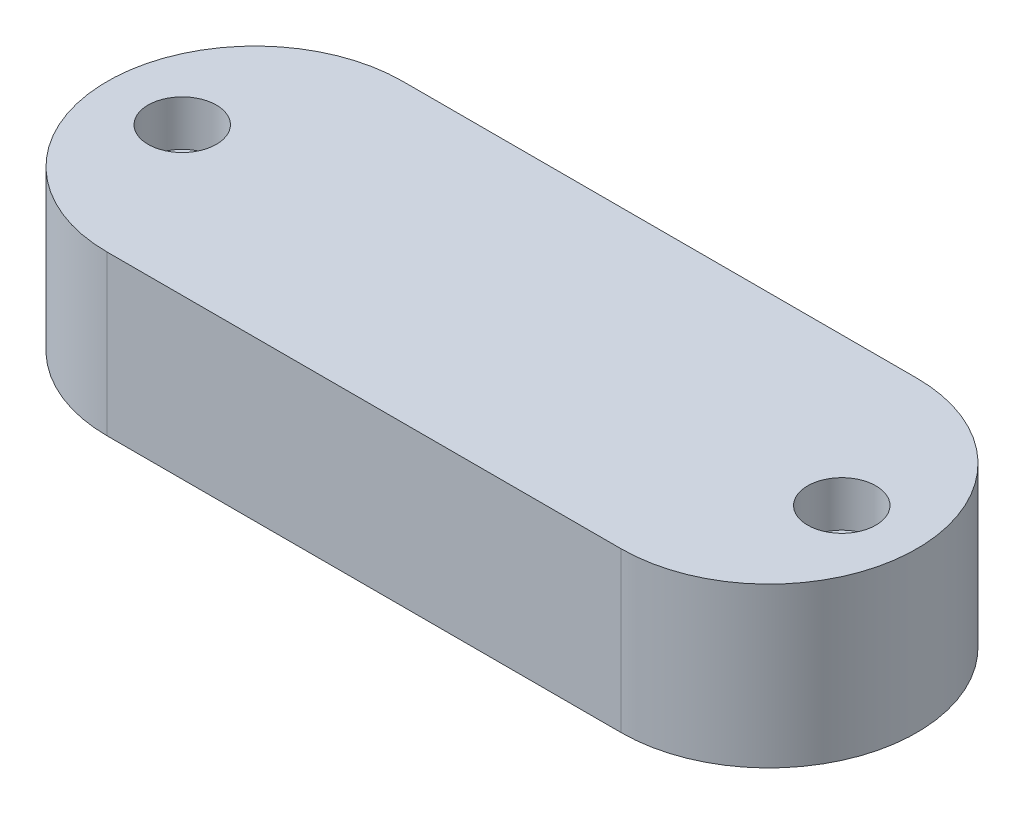
ISO-10303-21;
HEADER;
FILE_DESCRIPTION(('STEP AP214'),'2;1');
FILE_NAME('part.step','',(''),(''),'','','');
FILE_SCHEMA(('AUTOMOTIVE_DESIGN { 1 0 10303 214 1 1 1 1 }'));
ENDSEC;
DATA;
#1=APPLICATION_CONTEXT('core data for automotive mechanical design processes');
#2=APPLICATION_PROTOCOL_DEFINITION('international standard','automotive_design',2000,#1);
#3=PRODUCT_CONTEXT('',#1,'mechanical');
#4=PRODUCT('Part','Part','',(#3));
#5=PRODUCT_RELATED_PRODUCT_CATEGORY('part','',(#4));
#6=PRODUCT_DEFINITION_FORMATION('','',#4);
#7=PRODUCT_DEFINITION_CONTEXT('part definition',#1,'design');
#8=PRODUCT_DEFINITION('design','',#6,#7);
#9=PRODUCT_DEFINITION_SHAPE('','',#8);
#10=(LENGTH_UNIT() NAMED_UNIT(*) SI_UNIT(.MILLI.,.METRE.));
#11=(NAMED_UNIT(*) PLANE_ANGLE_UNIT() SI_UNIT($,.RADIAN.));
#12=(NAMED_UNIT(*) SI_UNIT($,.STERADIAN.) SOLID_ANGLE_UNIT());
#13=UNCERTAINTY_MEASURE_WITH_UNIT(LENGTH_MEASURE(1.E-05),#10,'distance_accuracy_value','');
#14=(GEOMETRIC_REPRESENTATION_CONTEXT(3) GLOBAL_UNCERTAINTY_ASSIGNED_CONTEXT((#13)) GLOBAL_UNIT_ASSIGNED_CONTEXT((#10,
#11,#12)) REPRESENTATION_CONTEXT('',''));
#15=CARTESIAN_POINT('',(0.,0.,0.));
#16=DIRECTION('',(0.,0.,1.));
#17=DIRECTION('',(1.,0.,0.));
#18=AXIS2_PLACEMENT_3D('',#15,#16,#17);
#19=CARTESIAN_POINT('',(-11.3,7.,0.));
#20=DIRECTION('',(0.,-1.,0.));
#21=DIRECTION('',(0.,0.,-1.));
#22=AXIS2_PLACEMENT_3D('',#19,#20,#21);
#23=CYLINDRICAL_SURFACE('',#22,6.5);
#24=CARTESIAN_POINT('',(-11.3,0.,0.));
#25=DIRECTION('',(0.,1.,0.));
#26=DIRECTION('',(0.,0.,1.));
#27=AXIS2_PLACEMENT_3D('',#24,#25,#26);
#28=CIRCLE('',#27,6.5);
#29=CARTESIAN_POINT('',(-11.3,0.,-6.5));
#30=VERTEX_POINT('',#29);
#31=CARTESIAN_POINT('',(-11.3,0.,6.5));
#32=VERTEX_POINT('',#31);
#33=EDGE_CURVE('E104',#30,#32,#28,.T.);
#34=ORIENTED_EDGE('',*,*,#33,.T.);
#35=DIRECTION('',(0.,-1.,0.));
#36=VECTOR('',#35,1.);
#37=CARTESIAN_POINT('',(-11.3,7.,6.5));
#38=LINE('',#37,#36);
#39=CARTESIAN_POINT('',(-11.3,7.,6.5));
#40=VERTEX_POINT('',#39);
#41=EDGE_CURVE('E11',#40,#32,#38,.T.);
#42=ORIENTED_EDGE('',*,*,#41,.F.);
#43=CARTESIAN_POINT('',(-11.3,7.,0.));
#44=DIRECTION('',(0.,1.,0.));
#45=DIRECTION('',(0.,0.,1.));
#46=AXIS2_PLACEMENT_3D('',#43,#44,#45);
#47=CIRCLE('',#46,6.5);
#48=CARTESIAN_POINT('',(-11.3,7.,-6.5));
#49=VERTEX_POINT('',#48);
#50=EDGE_CURVE('E92',#49,#40,#47,.T.);
#51=ORIENTED_EDGE('',*,*,#50,.F.);
#52=DIRECTION('',(0.,-1.,0.));
#53=VECTOR('',#52,1.);
#54=CARTESIAN_POINT('',(-11.3,7.,-6.5));
#55=LINE('',#54,#53);
#56=EDGE_CURVE('E100',#49,#30,#55,.T.);
#57=ORIENTED_EDGE('',*,*,#56,.T.);
#58=EDGE_LOOP('',(#34,#42,#51,#57));
#59=FACE_BOUND('',#58,.T.);
#60=ADVANCED_FACE('F41',(#59),#23,.T.);
#61=CARTESIAN_POINT('',(-11.3,7.,6.5));
#62=DIRECTION('',(0.,0.,-1.));
#63=DIRECTION('',(-1.,0.,0.));
#64=AXIS2_PLACEMENT_3D('',#61,#62,#63);
#65=PLANE('',#64);
#66=DIRECTION('',(1.,0.,0.));
#67=VECTOR('',#66,1.);
#68=CARTESIAN_POINT('',(-11.3,0.,6.5));
#69=LINE('',#68,#67);
#70=CARTESIAN_POINT('',(11.3,0.,6.5));
#71=VERTEX_POINT('',#70);
#72=EDGE_CURVE('E96',#32,#71,#69,.T.);
#73=ORIENTED_EDGE('',*,*,#72,.T.);
#74=DIRECTION('',(0.,-1.,0.));
#75=VECTOR('',#74,1.);
#76=CARTESIAN_POINT('',(11.3,7.,6.5));
#77=LINE('',#76,#75);
#78=CARTESIAN_POINT('',(11.3,7.,6.5));
#79=VERTEX_POINT('',#78);
#80=EDGE_CURVE('E49',#79,#71,#77,.T.);
#81=ORIENTED_EDGE('',*,*,#80,.F.);
#82=DIRECTION('',(1.,0.,0.));
#83=VECTOR('',#82,1.);
#84=CARTESIAN_POINT('',(-11.3,7.,6.5));
#85=LINE('',#84,#83);
#86=EDGE_CURVE('E87',#40,#79,#85,.T.);
#87=ORIENTED_EDGE('',*,*,#86,.F.);
#88=ORIENTED_EDGE('',*,*,#41,.T.);
#89=EDGE_LOOP('',(#73,#81,#87,#88));
#90=FACE_BOUND('',#89,.T.);
#91=ADVANCED_FACE('F95',(#90),#65,.F.);
#92=CARTESIAN_POINT('',(11.3,7.,0.));
#93=DIRECTION('',(0.,-1.,0.));
#94=DIRECTION('',(0.,0.,-1.));
#95=AXIS2_PLACEMENT_3D('',#92,#93,#94);
#96=CYLINDRICAL_SURFACE('',#95,6.5);
#97=CARTESIAN_POINT('',(11.3,0.,0.));
#98=DIRECTION('',(0.,1.,0.));
#99=DIRECTION('',(0.,0.,1.));
#100=AXIS2_PLACEMENT_3D('',#97,#98,#99);
#101=CIRCLE('',#100,6.5);
#102=CARTESIAN_POINT('',(11.3,0.,-6.5));
#103=VERTEX_POINT('',#102);
#104=EDGE_CURVE('E74',#71,#103,#101,.T.);
#105=ORIENTED_EDGE('',*,*,#104,.T.);
#106=DIRECTION('',(0.,-1.,0.));
#107=VECTOR('',#106,1.);
#108=CARTESIAN_POINT('',(11.3,7.,-6.5));
#109=LINE('',#108,#107);
#110=CARTESIAN_POINT('',(11.3,7.,-6.5));
#111=VERTEX_POINT('',#110);
#112=EDGE_CURVE('E97',#111,#103,#109,.T.);
#113=ORIENTED_EDGE('',*,*,#112,.F.);
#114=CARTESIAN_POINT('',(11.3,7.,0.));
#115=DIRECTION('',(0.,1.,0.));
#116=DIRECTION('',(0.,0.,1.));
#117=AXIS2_PLACEMENT_3D('',#114,#115,#116);
#118=CIRCLE('',#117,6.5);
#119=EDGE_CURVE('E90',#79,#111,#118,.T.);
#120=ORIENTED_EDGE('',*,*,#119,.F.);
#121=ORIENTED_EDGE('',*,*,#80,.T.);
#122=EDGE_LOOP('',(#105,#113,#120,#121));
#123=FACE_BOUND('',#122,.T.);
#124=ADVANCED_FACE('F98',(#123),#96,.T.);
#125=CARTESIAN_POINT('',(-11.3,7.,-6.5));
#126=DIRECTION('',(0.,0.,1.));
#127=DIRECTION('',(1.,0.,0.));
#128=AXIS2_PLACEMENT_3D('',#125,#126,#127);
#129=PLANE('',#128);
#130=DIRECTION('',(-1.,0.,0.));
#131=VECTOR('',#130,1.);
#132=CARTESIAN_POINT('',(-11.3,0.,-6.5));
#133=LINE('',#132,#131);
#134=EDGE_CURVE('E80',#103,#30,#133,.T.);
#135=ORIENTED_EDGE('',*,*,#134,.T.);
#136=ORIENTED_EDGE('',*,*,#56,.F.);
#137=DIRECTION('',(-1.,0.,0.));
#138=VECTOR('',#137,1.);
#139=CARTESIAN_POINT('',(-11.3,7.,-6.5));
#140=LINE('',#139,#138);
#141=EDGE_CURVE('E57',#111,#49,#140,.T.);
#142=ORIENTED_EDGE('',*,*,#141,.F.);
#143=ORIENTED_EDGE('',*,*,#112,.T.);
#144=EDGE_LOOP('',(#135,#136,#142,#143));
#145=FACE_BOUND('',#144,.T.);
#146=ADVANCED_FACE('F112',(#145),#129,.F.);
#147=CARTESIAN_POINT('',(-11.3,7.,0.));
#148=DIRECTION('',(0.,1.,0.));
#149=DIRECTION('',(0.,0.,1.));
#150=AXIS2_PLACEMENT_3D('',#147,#148,#149);
#151=PLANE('',#150);
#152=CARTESIAN_POINT('',(14.5,7.,0.));
#153=DIRECTION('',(0.,1.,0.));
#154=DIRECTION('',(0.,0.,1.));
#155=AXIS2_PLACEMENT_3D('',#152,#153,#154);
#156=CIRCLE('',#155,1.5);
#157=CARTESIAN_POINT('',(14.5,7.,1.5));
#158=VERTEX_POINT('',#157);
#159=EDGE_CURVE('E124',#158,#158,#156,.T.);
#160=ORIENTED_EDGE('',*,*,#159,.F.);
#161=EDGE_LOOP('',(#160));
#162=FACE_BOUND('',#161,.T.);
#163=CARTESIAN_POINT('',(-14.5,7.,0.));
#164=DIRECTION('',(0.,1.,0.));
#165=DIRECTION('',(0.,0.,-1.));
#166=AXIS2_PLACEMENT_3D('',#163,#164,#165);
#167=CIRCLE('',#166,1.5);
#168=CARTESIAN_POINT('',(-14.5,7.,-1.5));
#169=VERTEX_POINT('',#168);
#170=EDGE_CURVE('E121',#169,#169,#167,.T.);
#171=ORIENTED_EDGE('',*,*,#170,.F.);
#172=EDGE_LOOP('',(#171));
#173=FACE_BOUND('',#172,.T.);
#174=ORIENTED_EDGE('',*,*,#50,.T.);
#175=ORIENTED_EDGE('',*,*,#86,.T.);
#176=ORIENTED_EDGE('',*,*,#119,.T.);
#177=ORIENTED_EDGE('',*,*,#141,.T.);
#178=EDGE_LOOP('',(#174,#175,#176,#177));
#179=FACE_BOUND('',#178,.T.);
#180=ADVANCED_FACE('F88',(#162,#173,#179),#151,.T.);
#181=CARTESIAN_POINT('',(-11.3,0.,0.));
#182=DIRECTION('',(0.,1.,0.));
#183=DIRECTION('',(0.,0.,1.));
#184=AXIS2_PLACEMENT_3D('',#181,#182,#183);
#185=PLANE('',#184);
#186=ORIENTED_EDGE('',*,*,#33,.F.);
#187=ORIENTED_EDGE('',*,*,#134,.F.);
#188=ORIENTED_EDGE('',*,*,#104,.F.);
#189=ORIENTED_EDGE('',*,*,#72,.F.);
#190=EDGE_LOOP('',(#186,#187,#188,#189));
#191=FACE_BOUND('',#190,.T.);
#192=ADVANCED_FACE('F115',(#191),#185,.F.);
#193=CARTESIAN_POINT('',(-14.5,5.,0.));
#194=DIRECTION('',(0.,1.,0.));
#195=DIRECTION('',(0.,0.,1.));
#196=AXIS2_PLACEMENT_3D('',#193,#194,#195);
#197=CYLINDRICAL_SURFACE('',#196,1.5);
#198=CARTESIAN_POINT('',(-14.5,5.,0.));
#199=DIRECTION('',(0.,1.,0.));
#200=DIRECTION('',(0.,0.,-1.));
#201=AXIS2_PLACEMENT_3D('',#198,#199,#200);
#202=CIRCLE('',#201,1.5);
#203=CARTESIAN_POINT('',(-14.5,5.,-1.5));
#204=VERTEX_POINT('',#203);
#205=EDGE_CURVE('E118',#204,#204,#202,.T.);
#206=ORIENTED_EDGE('',*,*,#205,.F.);
#207=EDGE_LOOP('',(#206));
#208=FACE_BOUND('',#207,.T.);
#209=ORIENTED_EDGE('',*,*,#170,.T.);
#210=EDGE_LOOP('',(#209));
#211=FACE_BOUND('',#210,.T.);
#212=ADVANCED_FACE('F144',(#208,#211),#197,.F.);
#213=CARTESIAN_POINT('',(-14.5,5.,0.));
#214=DIRECTION('',(0.,-1.,0.));
#215=DIRECTION('',(0.,0.,-1.));
#216=AXIS2_PLACEMENT_3D('',#213,#214,#215);
#217=PLANE('',#216);
#218=ORIENTED_EDGE('',*,*,#205,.T.);
#219=EDGE_LOOP('',(#218));
#220=FACE_BOUND('',#219,.T.);
#221=ADVANCED_FACE('F135',(#220),#217,.F.);
#222=CARTESIAN_POINT('',(14.5,5.,0.));
#223=DIRECTION('',(0.,1.,0.));
#224=DIRECTION('',(0.,0.,1.));
#225=AXIS2_PLACEMENT_3D('',#222,#223,#224);
#226=CYLINDRICAL_SURFACE('',#225,1.5);
#227=CARTESIAN_POINT('',(14.5,5.,0.));
#228=DIRECTION('',(0.,1.,0.));
#229=DIRECTION('',(0.,0.,1.));
#230=AXIS2_PLACEMENT_3D('',#227,#228,#229);
#231=CIRCLE('',#230,1.5);
#232=CARTESIAN_POINT('',(14.5,5.,1.5));
#233=VERTEX_POINT('',#232);
#234=EDGE_CURVE('E107',#233,#233,#231,.T.);
#235=ORIENTED_EDGE('',*,*,#234,.F.);
#236=EDGE_LOOP('',(#235));
#237=FACE_BOUND('',#236,.T.);
#238=ORIENTED_EDGE('',*,*,#159,.T.);
#239=EDGE_LOOP('',(#238));
#240=FACE_BOUND('',#239,.T.);
#241=ADVANCED_FACE('F132',(#237,#240),#226,.F.);
#242=CARTESIAN_POINT('',(14.5,5.,0.));
#243=DIRECTION('',(0.,1.,0.));
#244=DIRECTION('',(0.,0.,1.));
#245=AXIS2_PLACEMENT_3D('',#242,#243,#244);
#246=PLANE('',#245);
#247=ORIENTED_EDGE('',*,*,#234,.T.);
#248=EDGE_LOOP('',(#247));
#249=FACE_BOUND('',#248,.T.);
#250=ADVANCED_FACE('F130',(#249),#246,.T.);
#251=CLOSED_SHELL('',(#60,#91,#124,#146,#180,#192,#212,#221,#241,#250));
#252=MANIFOLD_SOLID_BREP('B2',#251);
#253=ADVANCED_BREP_SHAPE_REPRESENTATION('',(#18,#252),#14);
#254=SHAPE_DEFINITION_REPRESENTATION(#9,#253);
ENDSEC;
END-ISO-10303-21;
